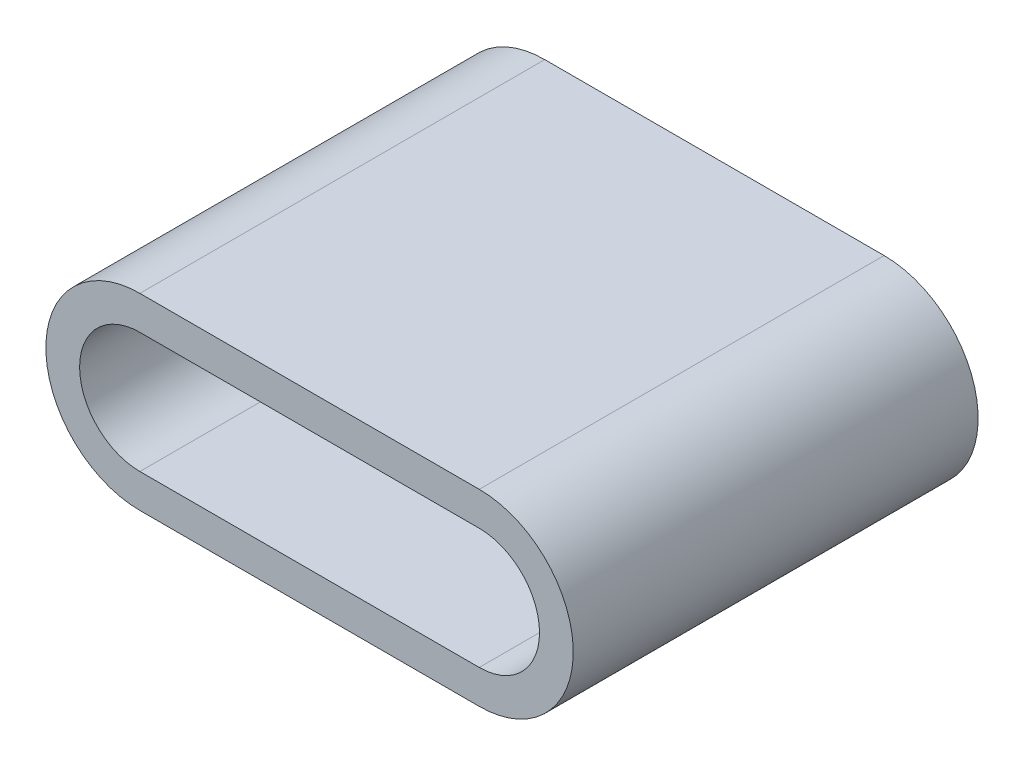
ISO-10303-21;
HEADER;
FILE_DESCRIPTION(('STEP AP214'),'2;1');
FILE_NAME('part.step','',(''),(''),'','','');
FILE_SCHEMA(('AUTOMOTIVE_DESIGN { 1 0 10303 214 1 1 1 1 }'));
ENDSEC;
DATA;
#1=APPLICATION_CONTEXT('core data for automotive mechanical design processes');
#2=APPLICATION_PROTOCOL_DEFINITION('international standard','automotive_design',2000,#1);
#3=PRODUCT_CONTEXT('',#1,'mechanical');
#4=PRODUCT('Part','Part','',(#3));
#5=PRODUCT_RELATED_PRODUCT_CATEGORY('part','',(#4));
#6=PRODUCT_DEFINITION_FORMATION('','',#4);
#7=PRODUCT_DEFINITION_CONTEXT('part definition',#1,'design');
#8=PRODUCT_DEFINITION('design','',#6,#7);
#9=PRODUCT_DEFINITION_SHAPE('','',#8);
#10=(LENGTH_UNIT() NAMED_UNIT(*) SI_UNIT(.MILLI.,.METRE.));
#11=(NAMED_UNIT(*) PLANE_ANGLE_UNIT() SI_UNIT($,.RADIAN.));
#12=(NAMED_UNIT(*) SI_UNIT($,.STERADIAN.) SOLID_ANGLE_UNIT());
#13=UNCERTAINTY_MEASURE_WITH_UNIT(LENGTH_MEASURE(1.E-05),#10,'distance_accuracy_value','');
#14=(GEOMETRIC_REPRESENTATION_CONTEXT(3) GLOBAL_UNCERTAINTY_ASSIGNED_CONTEXT((#13)) GLOBAL_UNIT_ASSIGNED_CONTEXT((#10,
#11,#12)) REPRESENTATION_CONTEXT('',''));
#15=CARTESIAN_POINT('',(0.,0.,0.));
#16=DIRECTION('',(0.,0.,1.));
#17=DIRECTION('',(1.,0.,0.));
#18=AXIS2_PLACEMENT_3D('',#15,#16,#17);
#19=CARTESIAN_POINT('',(0.,0.,10.));
#20=DIRECTION('',(0.,0.,-1.));
#21=DIRECTION('',(-1.,0.,0.));
#22=AXIS2_PLACEMENT_3D('',#19,#20,#21);
#23=CYLINDRICAL_SURFACE('',#22,13.9306882760523);
#24=DIRECTION('',(0.,0.,-1.));
#25=VECTOR('',#24,1.);
#26=CARTESIAN_POINT('',(0.,13.9306882760523,10.));
#27=LINE('',#26,#25);
#28=CARTESIAN_POINT('',(0.,13.9306882760523,40.));
#29=VERTEX_POINT('',#28);
#30=CARTESIAN_POINT('',(0.,13.9306882760523,-20.));
#31=VERTEX_POINT('',#30);
#32=EDGE_CURVE('E83',#29,#31,#27,.T.);
#33=ORIENTED_EDGE('',*,*,#32,.T.);
#34=CARTESIAN_POINT('',(0.,0.,-20.));
#35=DIRECTION('',(0.,0.,1.));
#36=DIRECTION('',(1.,0.,0.));
#37=AXIS2_PLACEMENT_3D('',#34,#35,#36);
#38=CIRCLE('',#37,13.9306882760523);
#39=CARTESIAN_POINT('',(0.,-13.9306882760523,-20.));
#40=VERTEX_POINT('',#39);
#41=EDGE_CURVE('E170',#31,#40,#38,.T.);
#42=ORIENTED_EDGE('',*,*,#41,.T.);
#43=DIRECTION('',(0.,0.,-1.));
#44=VECTOR('',#43,1.);
#45=CARTESIAN_POINT('',(0.,-13.9306882760523,10.));
#46=LINE('',#45,#44);
#47=CARTESIAN_POINT('',(0.,-13.9306882760523,40.));
#48=VERTEX_POINT('',#47);
#49=EDGE_CURVE('E12',#48,#40,#46,.T.);
#50=ORIENTED_EDGE('',*,*,#49,.F.);
#51=CARTESIAN_POINT('',(0.,0.,40.));
#52=DIRECTION('',(0.,0.,1.));
#53=DIRECTION('',(1.,0.,0.));
#54=AXIS2_PLACEMENT_3D('',#51,#52,#53);
#55=CIRCLE('',#54,13.9306882760523);
#56=EDGE_CURVE('E159',#29,#48,#55,.T.);
#57=ORIENTED_EDGE('',*,*,#56,.F.);
#58=EDGE_LOOP('',(#33,#42,#50,#57));
#59=FACE_BOUND('',#58,.T.);
#60=ADVANCED_FACE('F61',(#59),#23,.T.);
#61=CARTESIAN_POINT('',(0.,-13.9306882760523,10.));
#62=DIRECTION('',(0.,1.,0.));
#63=DIRECTION('',(0.,0.,1.));
#64=AXIS2_PLACEMENT_3D('',#61,#62,#63);
#65=PLANE('',#64);
#66=ORIENTED_EDGE('',*,*,#49,.T.);
#67=DIRECTION('',(1.,0.,0.));
#68=VECTOR('',#67,1.);
#69=CARTESIAN_POINT('',(0.,-13.9306882760523,-20.));
#70=LINE('',#69,#68);
#71=CARTESIAN_POINT('',(50.2906608204655,-13.9306882760523,-20.));
#72=VERTEX_POINT('',#71);
#73=EDGE_CURVE('E172',#40,#72,#70,.T.);
#74=ORIENTED_EDGE('',*,*,#73,.T.);
#75=DIRECTION('',(0.,0.,-1.));
#76=VECTOR('',#75,1.);
#77=CARTESIAN_POINT('',(50.2906608204655,-13.9306882760523,10.));
#78=LINE('',#77,#76);
#79=CARTESIAN_POINT('',(50.2906608204655,-13.9306882760523,40.));
#80=VERTEX_POINT('',#79);
#81=EDGE_CURVE('E68',#80,#72,#78,.T.);
#82=ORIENTED_EDGE('',*,*,#81,.F.);
#83=DIRECTION('',(1.,0.,0.));
#84=VECTOR('',#83,1.);
#85=CARTESIAN_POINT('',(0.,-13.9306882760523,40.));
#86=LINE('',#85,#84);
#87=EDGE_CURVE('E162',#48,#80,#86,.T.);
#88=ORIENTED_EDGE('',*,*,#87,.F.);
#89=EDGE_LOOP('',(#66,#74,#82,#88));
#90=FACE_BOUND('',#89,.T.);
#91=ADVANCED_FACE('F193',(#90),#65,.F.);
#92=CARTESIAN_POINT('',(50.2906608204655,0.,10.));
#93=DIRECTION('',(0.,0.,-1.));
#94=DIRECTION('',(-1.,0.,0.));
#95=AXIS2_PLACEMENT_3D('',#92,#93,#94);
#96=CYLINDRICAL_SURFACE('',#95,13.9306882760523);
#97=ORIENTED_EDGE('',*,*,#81,.T.);
#98=CARTESIAN_POINT('',(50.2906608204655,0.,-20.));
#99=DIRECTION('',(0.,0.,1.));
#100=DIRECTION('',(1.,0.,0.));
#101=AXIS2_PLACEMENT_3D('',#98,#99,#100);
#102=CIRCLE('',#101,13.9306882760523);
#103=CARTESIAN_POINT('',(50.2906608204655,13.9306882760523,-20.));
#104=VERTEX_POINT('',#103);
#105=EDGE_CURVE('E175',#72,#104,#102,.T.);
#106=ORIENTED_EDGE('',*,*,#105,.T.);
#107=DIRECTION('',(0.,0.,-1.));
#108=VECTOR('',#107,1.);
#109=CARTESIAN_POINT('',(50.2906608204655,13.9306882760523,10.));
#110=LINE('',#109,#108);
#111=CARTESIAN_POINT('',(50.2906608204655,13.9306882760523,40.));
#112=VERTEX_POINT('',#111);
#113=EDGE_CURVE('E182',#112,#104,#110,.T.);
#114=ORIENTED_EDGE('',*,*,#113,.F.);
#115=CARTESIAN_POINT('',(50.2906608204655,0.,40.));
#116=DIRECTION('',(0.,0.,1.));
#117=DIRECTION('',(1.,0.,0.));
#118=AXIS2_PLACEMENT_3D('',#115,#116,#117);
#119=CIRCLE('',#118,13.9306882760523);
#120=EDGE_CURVE('E165',#80,#112,#119,.T.);
#121=ORIENTED_EDGE('',*,*,#120,.F.);
#122=EDGE_LOOP('',(#97,#106,#114,#121));
#123=FACE_BOUND('',#122,.T.);
#124=ADVANCED_FACE('F186',(#123),#96,.T.);
#125=CARTESIAN_POINT('',(0.,13.9306882760523,10.));
#126=DIRECTION('',(0.,-1.,0.));
#127=DIRECTION('',(0.,0.,-1.));
#128=AXIS2_PLACEMENT_3D('',#125,#126,#127);
#129=PLANE('',#128);
#130=ORIENTED_EDGE('',*,*,#113,.T.);
#131=DIRECTION('',(-1.,0.,0.));
#132=VECTOR('',#131,1.);
#133=CARTESIAN_POINT('',(0.,13.9306882760523,-20.));
#134=LINE('',#133,#132);
#135=EDGE_CURVE('E178',#104,#31,#134,.T.);
#136=ORIENTED_EDGE('',*,*,#135,.T.);
#137=ORIENTED_EDGE('',*,*,#32,.F.);
#138=DIRECTION('',(-1.,0.,0.));
#139=VECTOR('',#138,1.);
#140=CARTESIAN_POINT('',(50.2906608204655,13.9306882760523,40.));
#141=LINE('',#140,#139);
#142=EDGE_CURVE('E154',#112,#29,#141,.T.);
#143=ORIENTED_EDGE('',*,*,#142,.F.);
#144=EDGE_LOOP('',(#130,#136,#137,#143));
#145=FACE_BOUND('',#144,.T.);
#146=ADVANCED_FACE('F195',(#145),#129,.F.);
#147=CARTESIAN_POINT('',(0.,0.,-20.));
#148=DIRECTION('',(0.,0.,1.));
#149=DIRECTION('',(1.,0.,0.));
#150=AXIS2_PLACEMENT_3D('',#147,#148,#149);
#151=PLANE('',#150);
#152=ORIENTED_EDGE('',*,*,#41,.F.);
#153=ORIENTED_EDGE('',*,*,#135,.F.);
#154=ORIENTED_EDGE('',*,*,#105,.F.);
#155=ORIENTED_EDGE('',*,*,#73,.F.);
#156=EDGE_LOOP('',(#152,#153,#154,#155));
#157=FACE_BOUND('',#156,.T.);
#158=ADVANCED_FACE('F192',(#157),#151,.F.);
#159=CARTESIAN_POINT('',(0.,0.,40.));
#160=DIRECTION('',(0.,0.,1.));
#161=DIRECTION('',(1.,0.,0.));
#162=AXIS2_PLACEMENT_3D('',#159,#160,#161);
#163=PLANE('',#162);
#164=DIRECTION('',(-1.,0.,0.));
#165=VECTOR('',#164,1.);
#166=CARTESIAN_POINT('',(50.2906608204655,8.93068827605229,40.));
#167=LINE('',#166,#165);
#168=CARTESIAN_POINT('',(50.2906608204655,8.93068827605229,40.));
#169=VERTEX_POINT('',#168);
#170=CARTESIAN_POINT('',(0.,8.93068827605229,40.));
#171=VERTEX_POINT('',#170);
#172=EDGE_CURVE('E142',#169,#171,#167,.T.);
#173=ORIENTED_EDGE('',*,*,#172,.F.);
#174=CARTESIAN_POINT('',(50.2906608204655,0.,40.));
#175=DIRECTION('',(0.,0.,1.));
#176=DIRECTION('',(1.,0.,0.));
#177=AXIS2_PLACEMENT_3D('',#174,#175,#176);
#178=CIRCLE('',#177,8.93068827605229);
#179=CARTESIAN_POINT('',(50.2906608204655,-8.93068827605229,40.));
#180=VERTEX_POINT('',#179);
#181=EDGE_CURVE('E147',#180,#169,#178,.T.);
#182=ORIENTED_EDGE('',*,*,#181,.F.);
#183=DIRECTION('',(1.,0.,0.));
#184=VECTOR('',#183,1.);
#185=CARTESIAN_POINT('',(0.,-8.93068827605229,40.));
#186=LINE('',#185,#184);
#187=CARTESIAN_POINT('',(0.,-8.93068827605229,40.));
#188=VERTEX_POINT('',#187);
#189=EDGE_CURVE('E129',#188,#180,#186,.T.);
#190=ORIENTED_EDGE('',*,*,#189,.F.);
#191=CARTESIAN_POINT('',(0.,0.,40.));
#192=DIRECTION('',(0.,0.,1.));
#193=DIRECTION('',(1.,0.,0.));
#194=AXIS2_PLACEMENT_3D('',#191,#192,#193);
#195=CIRCLE('',#194,8.93068827605229);
#196=EDGE_CURVE('E137',#171,#188,#195,.T.);
#197=ORIENTED_EDGE('',*,*,#196,.F.);
#198=EDGE_LOOP('',(#173,#182,#190,#197));
#199=FACE_BOUND('',#198,.T.);
#200=ORIENTED_EDGE('',*,*,#142,.T.);
#201=ORIENTED_EDGE('',*,*,#56,.T.);
#202=ORIENTED_EDGE('',*,*,#87,.T.);
#203=ORIENTED_EDGE('',*,*,#120,.T.);
#204=EDGE_LOOP('',(#200,#201,#202,#203));
#205=FACE_BOUND('',#204,.T.);
#206=ADVANCED_FACE('F144',(#199,#205),#163,.T.);
#207=CARTESIAN_POINT('',(0.,0.,-72.9698574716249));
#208=DIRECTION('',(0.,0.,1.));
#209=DIRECTION('',(1.,0.,0.));
#210=AXIS2_PLACEMENT_3D('',#207,#208,#209);
#211=CYLINDRICAL_SURFACE('',#210,8.93068827605229);
#212=DIRECTION('',(0.,0.,1.));
#213=VECTOR('',#212,1.);
#214=CARTESIAN_POINT('',(0.,-8.93068827605229,-72.9698574716249));
#215=LINE('',#214,#213);
#216=CARTESIAN_POINT('',(0.,-8.93068827605229,9.99999999999999));
#217=VERTEX_POINT('',#216);
#218=EDGE_CURVE('E125',#217,#188,#215,.T.);
#219=ORIENTED_EDGE('',*,*,#218,.F.);
#220=CARTESIAN_POINT('',(0.,0.,9.99999999999999));
#221=DIRECTION('',(0.,0.,1.));
#222=DIRECTION('',(1.,0.,0.));
#223=AXIS2_PLACEMENT_3D('',#220,#221,#222);
#224=CIRCLE('',#223,8.93068827605229);
#225=CARTESIAN_POINT('',(0.,8.93068827605229,10.));
#226=VERTEX_POINT('',#225);
#227=EDGE_CURVE('E75',#217,#226,#224,.F.);
#228=ORIENTED_EDGE('',*,*,#227,.T.);
#229=DIRECTION('',(0.,0.,1.));
#230=VECTOR('',#229,1.);
#231=CARTESIAN_POINT('',(0.,8.93068827605229,-72.9698574716249));
#232=LINE('',#231,#230);
#233=EDGE_CURVE('E134',#226,#171,#232,.T.);
#234=ORIENTED_EDGE('',*,*,#233,.T.);
#235=ORIENTED_EDGE('',*,*,#196,.T.);
#236=EDGE_LOOP('',(#219,#228,#234,#235));
#237=FACE_BOUND('',#236,.T.);
#238=ADVANCED_FACE('F138',(#237),#211,.F.);
#239=CARTESIAN_POINT('',(0.,-8.93068827605229,-72.9698574716249));
#240=DIRECTION('',(0.,-1.,0.));
#241=DIRECTION('',(0.,0.,-1.));
#242=AXIS2_PLACEMENT_3D('',#239,#240,#241);
#243=PLANE('',#242);
#244=DIRECTION('',(0.,0.,1.));
#245=VECTOR('',#244,1.);
#246=CARTESIAN_POINT('',(50.2906608204655,-8.93068827605229,-72.9698574716249));
#247=LINE('',#246,#245);
#248=CARTESIAN_POINT('',(50.2906608204655,-8.93068827605229,9.99999999999999));
#249=VERTEX_POINT('',#248);
#250=EDGE_CURVE('E133',#249,#180,#247,.T.);
#251=ORIENTED_EDGE('',*,*,#250,.F.);
#252=DIRECTION('',(-1.,0.,0.));
#253=VECTOR('',#252,1.);
#254=CARTESIAN_POINT('',(0.,-8.93068827605229,9.99999999999999));
#255=LINE('',#254,#253);
#256=EDGE_CURVE('E132',#249,#217,#255,.T.);
#257=ORIENTED_EDGE('',*,*,#256,.T.);
#258=ORIENTED_EDGE('',*,*,#218,.T.);
#259=ORIENTED_EDGE('',*,*,#189,.T.);
#260=EDGE_LOOP('',(#251,#257,#258,#259));
#261=FACE_BOUND('',#260,.T.);
#262=ADVANCED_FACE('F127',(#261),#243,.F.);
#263=CARTESIAN_POINT('',(50.2906608204655,0.,-72.9698574716249));
#264=DIRECTION('',(0.,0.,1.));
#265=DIRECTION('',(1.,0.,0.));
#266=AXIS2_PLACEMENT_3D('',#263,#264,#265);
#267=CYLINDRICAL_SURFACE('',#266,8.93068827605229);
#268=DIRECTION('',(0.,0.,1.));
#269=VECTOR('',#268,1.);
#270=CARTESIAN_POINT('',(50.2906608204655,8.93068827605229,-72.9698574716249));
#271=LINE('',#270,#269);
#272=CARTESIAN_POINT('',(50.2906608204655,8.93068827605229,9.99999999999999));
#273=VERTEX_POINT('',#272);
#274=EDGE_CURVE('E152',#273,#169,#271,.T.);
#275=ORIENTED_EDGE('',*,*,#274,.F.);
#276=CARTESIAN_POINT('',(50.2906608204655,0.,9.99999999999999));
#277=DIRECTION('',(0.,0.,1.));
#278=DIRECTION('',(1.,0.,0.));
#279=AXIS2_PLACEMENT_3D('',#276,#277,#278);
#280=CIRCLE('',#279,8.93068827605229);
#281=EDGE_CURVE('E230',#273,#249,#280,.F.);
#282=ORIENTED_EDGE('',*,*,#281,.T.);
#283=ORIENTED_EDGE('',*,*,#250,.T.);
#284=ORIENTED_EDGE('',*,*,#181,.T.);
#285=EDGE_LOOP('',(#275,#282,#283,#284));
#286=FACE_BOUND('',#285,.T.);
#287=ADVANCED_FACE('F224',(#286),#267,.F.);
#288=CARTESIAN_POINT('',(50.2906608204655,8.93068827605229,-72.9698574716249));
#289=DIRECTION('',(0.,1.,0.));
#290=DIRECTION('',(0.,0.,1.));
#291=AXIS2_PLACEMENT_3D('',#288,#289,#290);
#292=PLANE('',#291);
#293=ORIENTED_EDGE('',*,*,#233,.F.);
#294=DIRECTION('',(1.,0.,0.));
#295=VECTOR('',#294,1.);
#296=CARTESIAN_POINT('',(50.2906608204655,8.93068827605229,9.99999999999999));
#297=LINE('',#296,#295);
#298=EDGE_CURVE('E169',#226,#273,#297,.T.);
#299=ORIENTED_EDGE('',*,*,#298,.T.);
#300=ORIENTED_EDGE('',*,*,#274,.T.);
#301=ORIENTED_EDGE('',*,*,#172,.T.);
#302=EDGE_LOOP('',(#293,#299,#300,#301));
#303=FACE_BOUND('',#302,.T.);
#304=ADVANCED_FACE('F219',(#303),#292,.F.);
#305=CARTESIAN_POINT('',(0.,0.,10.));
#306=DIRECTION('',(0.,0.,1.));
#307=DIRECTION('',(1.,0.,0.));
#308=AXIS2_PLACEMENT_3D('',#305,#306,#307);
#309=PLANE('',#308);
#310=ORIENTED_EDGE('',*,*,#298,.F.);
#311=ORIENTED_EDGE('',*,*,#227,.F.);
#312=ORIENTED_EDGE('',*,*,#256,.F.);
#313=ORIENTED_EDGE('',*,*,#281,.F.);
#314=EDGE_LOOP('',(#310,#311,#312,#313));
#315=FACE_BOUND('',#314,.T.);
#316=ADVANCED_FACE('F217',(#315),#309,.T.);
#317=CLOSED_SHELL('',(#60,#91,#124,#146,#158,#206,#238,#262,#287,#304,#316));
#318=MANIFOLD_SOLID_BREP('B2',#317);
#319=ADVANCED_BREP_SHAPE_REPRESENTATION('',(#18,#318),#14);
#320=SHAPE_DEFINITION_REPRESENTATION(#9,#319);
ENDSEC;
END-ISO-10303-21;
